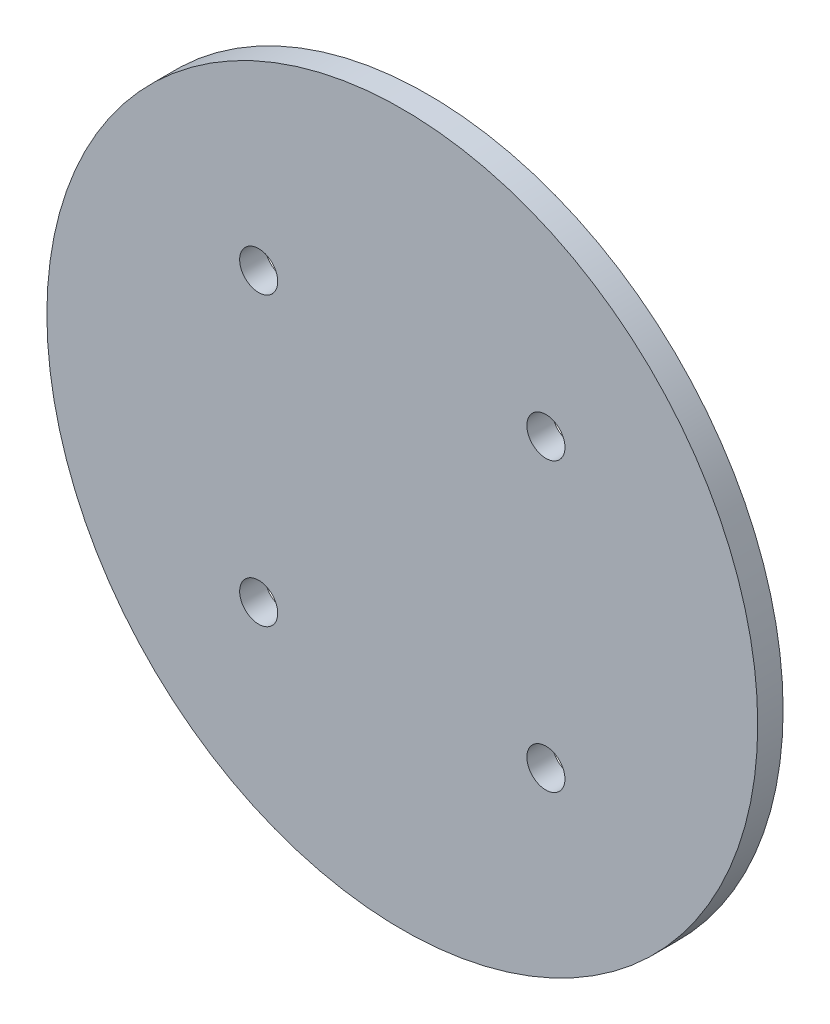
ISO-10303-21;
HEADER;
FILE_DESCRIPTION(('STEP AP214'),'2;1');
FILE_NAME('part.step','',(''),(''),'','','');
FILE_SCHEMA(('AUTOMOTIVE_DESIGN { 1 0 10303 214 1 1 1 1 }'));
ENDSEC;
DATA;
#1=APPLICATION_CONTEXT('core data for automotive mechanical design processes');
#2=APPLICATION_PROTOCOL_DEFINITION('international standard','automotive_design',2000,#1);
#3=PRODUCT_CONTEXT('',#1,'mechanical');
#4=PRODUCT('Part','Part','',(#3));
#5=PRODUCT_RELATED_PRODUCT_CATEGORY('part','',(#4));
#6=PRODUCT_DEFINITION_FORMATION('','',#4);
#7=PRODUCT_DEFINITION_CONTEXT('part definition',#1,'design');
#8=PRODUCT_DEFINITION('design','',#6,#7);
#9=PRODUCT_DEFINITION_SHAPE('','',#8);
#10=(LENGTH_UNIT() NAMED_UNIT(*) SI_UNIT(.MILLI.,.METRE.));
#11=(NAMED_UNIT(*) PLANE_ANGLE_UNIT() SI_UNIT($,.RADIAN.));
#12=(NAMED_UNIT(*) SI_UNIT($,.STERADIAN.) SOLID_ANGLE_UNIT());
#13=UNCERTAINTY_MEASURE_WITH_UNIT(LENGTH_MEASURE(1.E-05),#10,'distance_accuracy_value','');
#14=(GEOMETRIC_REPRESENTATION_CONTEXT(3) GLOBAL_UNCERTAINTY_ASSIGNED_CONTEXT((#13)) GLOBAL_UNIT_ASSIGNED_CONTEXT((#10,
#11,#12)) REPRESENTATION_CONTEXT('',''));
#15=CARTESIAN_POINT('',(0.,0.,0.));
#16=DIRECTION('',(0.,0.,1.));
#17=DIRECTION('',(1.,0.,0.));
#18=AXIS2_PLACEMENT_3D('',#15,#16,#17);
#19=CARTESIAN_POINT('',(0.,0.,6.35));
#20=DIRECTION('',(0.,0.,-1.));
#21=DIRECTION('',(-1.,0.,0.));
#22=AXIS2_PLACEMENT_3D('',#19,#20,#21);
#23=CYLINDRICAL_SURFACE('',#22,88.9);
#24=CARTESIAN_POINT('',(0.,0.,6.35));
#25=DIRECTION('',(0.,0.,1.));
#26=DIRECTION('',(1.,0.,0.));
#27=AXIS2_PLACEMENT_3D('',#24,#25,#26);
#28=CIRCLE('',#27,88.9);
#29=CARTESIAN_POINT('',(88.9,0.,6.35));
#30=VERTEX_POINT('',#29);
#31=EDGE_CURVE('E10',#30,#30,#28,.T.);
#32=ORIENTED_EDGE('',*,*,#31,.F.);
#33=EDGE_LOOP('',(#32));
#34=FACE_BOUND('',#33,.T.);
#35=CARTESIAN_POINT('',(0.,0.,0.));
#36=DIRECTION('',(0.,0.,1.));
#37=DIRECTION('',(1.,0.,0.));
#38=AXIS2_PLACEMENT_3D('',#35,#36,#37);
#39=CIRCLE('',#38,88.9);
#40=CARTESIAN_POINT('',(88.9,0.,0.));
#41=VERTEX_POINT('',#40);
#42=EDGE_CURVE('E34',#41,#41,#39,.T.);
#43=ORIENTED_EDGE('',*,*,#42,.T.);
#44=EDGE_LOOP('',(#43));
#45=FACE_BOUND('',#44,.T.);
#46=ADVANCED_FACE('F31',(#34,#45),#23,.T.);
#47=CARTESIAN_POINT('',(0.,0.,6.35));
#48=DIRECTION('',(0.,0.,1.));
#49=DIRECTION('',(1.,0.,0.));
#50=AXIS2_PLACEMENT_3D('',#47,#48,#49);
#51=PLANE('',#50);
#52=CARTESIAN_POINT('',(-35.9210244842765,-35.9210244842767,6.35));
#53=DIRECTION('',(0.,0.,1.));
#54=DIRECTION('',(1.,0.,0.));
#55=AXIS2_PLACEMENT_3D('',#52,#53,#54);
#56=CIRCLE('',#55,4.7625);
#57=CARTESIAN_POINT('',(-31.1585244842765,-35.9210244842767,6.35));
#58=VERTEX_POINT('',#57);
#59=EDGE_CURVE('E41',#58,#58,#56,.T.);
#60=ORIENTED_EDGE('',*,*,#59,.F.);
#61=EDGE_LOOP('',(#60));
#62=FACE_BOUND('',#61,.T.);
#63=CARTESIAN_POINT('',(35.9210244842766,-35.9210244842767,6.35));
#64=DIRECTION('',(0.,0.,1.));
#65=DIRECTION('',(1.,0.,0.));
#66=AXIS2_PLACEMENT_3D('',#63,#64,#65);
#67=CIRCLE('',#66,4.7625);
#68=CARTESIAN_POINT('',(40.6835244842766,-35.9210244842767,6.35));
#69=VERTEX_POINT('',#68);
#70=EDGE_CURVE('E45',#69,#69,#67,.T.);
#71=ORIENTED_EDGE('',*,*,#70,.F.);
#72=EDGE_LOOP('',(#71));
#73=FACE_BOUND('',#72,.T.);
#74=CARTESIAN_POINT('',(35.9210244842766,35.9210244842767,6.35));
#75=DIRECTION('',(0.,0.,1.));
#76=DIRECTION('',(1.,0.,0.));
#77=AXIS2_PLACEMENT_3D('',#74,#75,#76);
#78=CIRCLE('',#77,4.7625);
#79=CARTESIAN_POINT('',(40.6835244842766,35.9210244842767,6.35));
#80=VERTEX_POINT('',#79);
#81=EDGE_CURVE('E48',#80,#80,#78,.T.);
#82=ORIENTED_EDGE('',*,*,#81,.F.);
#83=EDGE_LOOP('',(#82));
#84=FACE_BOUND('',#83,.T.);
#85=CARTESIAN_POINT('',(-35.9210244842765,35.9210244842767,6.35));
#86=DIRECTION('',(0.,0.,1.));
#87=DIRECTION('',(1.,0.,0.));
#88=AXIS2_PLACEMENT_3D('',#85,#86,#87);
#89=CIRCLE('',#88,4.7625);
#90=CARTESIAN_POINT('',(-31.1585244842765,35.9210244842767,6.35));
#91=VERTEX_POINT('',#90);
#92=EDGE_CURVE('E51',#91,#91,#89,.T.);
#93=ORIENTED_EDGE('',*,*,#92,.F.);
#94=EDGE_LOOP('',(#93));
#95=FACE_BOUND('',#94,.T.);
#96=ORIENTED_EDGE('',*,*,#31,.T.);
#97=EDGE_LOOP('',(#96));
#98=FACE_BOUND('',#97,.T.);
#99=ADVANCED_FACE('F86',(#62,#73,#84,#95,#98),#51,.T.);
#100=CARTESIAN_POINT('',(0.,0.,0.));
#101=DIRECTION('',(0.,0.,1.));
#102=DIRECTION('',(1.,0.,0.));
#103=AXIS2_PLACEMENT_3D('',#100,#101,#102);
#104=PLANE('',#103);
#105=CARTESIAN_POINT('',(-35.9210244842765,-35.9210244842767,0.));
#106=DIRECTION('',(0.,0.,1.));
#107=DIRECTION('',(-1.,0.,0.));
#108=AXIS2_PLACEMENT_3D('',#105,#106,#107);
#109=CIRCLE('',#108,4.7625);
#110=CARTESIAN_POINT('',(-40.6835244842765,-35.9210244842767,0.));
#111=VERTEX_POINT('',#110);
#112=EDGE_CURVE('E58',#111,#111,#109,.T.);
#113=ORIENTED_EDGE('',*,*,#112,.T.);
#114=EDGE_LOOP('',(#113));
#115=FACE_BOUND('',#114,.T.);
#116=CARTESIAN_POINT('',(35.9210244842766,-35.9210244842767,0.));
#117=DIRECTION('',(0.,0.,1.));
#118=DIRECTION('',(1.,0.,0.));
#119=AXIS2_PLACEMENT_3D('',#116,#117,#118);
#120=CIRCLE('',#119,4.7625);
#121=CARTESIAN_POINT('',(40.6835244842766,-35.9210244842767,0.));
#122=VERTEX_POINT('',#121);
#123=EDGE_CURVE('E61',#122,#122,#120,.T.);
#124=ORIENTED_EDGE('',*,*,#123,.T.);
#125=EDGE_LOOP('',(#124));
#126=FACE_BOUND('',#125,.T.);
#127=CARTESIAN_POINT('',(35.9210244842766,35.9210244842767,0.));
#128=DIRECTION('',(0.,0.,1.));
#129=DIRECTION('',(-1.,0.,0.));
#130=AXIS2_PLACEMENT_3D('',#127,#128,#129);
#131=CIRCLE('',#130,4.7625);
#132=CARTESIAN_POINT('',(31.1585244842766,35.9210244842767,0.));
#133=VERTEX_POINT('',#132);
#134=EDGE_CURVE('E57',#133,#133,#131,.T.);
#135=ORIENTED_EDGE('',*,*,#134,.T.);
#136=EDGE_LOOP('',(#135));
#137=FACE_BOUND('',#136,.T.);
#138=CARTESIAN_POINT('',(-35.9210244842765,35.9210244842767,0.));
#139=DIRECTION('',(0.,0.,1.));
#140=DIRECTION('',(1.,0.,0.));
#141=AXIS2_PLACEMENT_3D('',#138,#139,#140);
#142=CIRCLE('',#141,4.7625);
#143=CARTESIAN_POINT('',(-31.1585244842765,35.9210244842767,0.));
#144=VERTEX_POINT('',#143);
#145=EDGE_CURVE('E54',#144,#144,#142,.T.);
#146=ORIENTED_EDGE('',*,*,#145,.T.);
#147=EDGE_LOOP('',(#146));
#148=FACE_BOUND('',#147,.T.);
#149=ORIENTED_EDGE('',*,*,#42,.F.);
#150=EDGE_LOOP('',(#149));
#151=FACE_BOUND('',#150,.T.);
#152=ADVANCED_FACE('F67',(#115,#126,#137,#148,#151),#104,.F.);
#153=CARTESIAN_POINT('',(-35.9210244842765,35.9210244842767,0.));
#154=DIRECTION('',(0.,0.,1.));
#155=DIRECTION('',(1.,0.,0.));
#156=AXIS2_PLACEMENT_3D('',#153,#154,#155);
#157=CYLINDRICAL_SURFACE('',#156,4.7625);
#158=ORIENTED_EDGE('',*,*,#92,.T.);
#159=EDGE_LOOP('',(#158));
#160=FACE_BOUND('',#159,.T.);
#161=ORIENTED_EDGE('',*,*,#145,.F.);
#162=EDGE_LOOP('',(#161));
#163=FACE_BOUND('',#162,.T.);
#164=ADVANCED_FACE('F73',(#160,#163),#157,.F.);
#165=CARTESIAN_POINT('',(35.9210244842766,35.9210244842767,0.));
#166=DIRECTION('',(0.,0.,1.));
#167=DIRECTION('',(1.,0.,0.));
#168=AXIS2_PLACEMENT_3D('',#165,#166,#167);
#169=CYLINDRICAL_SURFACE('',#168,4.7625);
#170=ORIENTED_EDGE('',*,*,#81,.T.);
#171=EDGE_LOOP('',(#170));
#172=FACE_BOUND('',#171,.T.);
#173=ORIENTED_EDGE('',*,*,#134,.F.);
#174=EDGE_LOOP('',(#173));
#175=FACE_BOUND('',#174,.T.);
#176=ADVANCED_FACE('F70',(#172,#175),#169,.F.);
#177=CARTESIAN_POINT('',(35.9210244842766,-35.9210244842767,0.));
#178=DIRECTION('',(0.,0.,1.));
#179=DIRECTION('',(1.,0.,0.));
#180=AXIS2_PLACEMENT_3D('',#177,#178,#179);
#181=CYLINDRICAL_SURFACE('',#180,4.7625);
#182=ORIENTED_EDGE('',*,*,#70,.T.);
#183=EDGE_LOOP('',(#182));
#184=FACE_BOUND('',#183,.T.);
#185=ORIENTED_EDGE('',*,*,#123,.F.);
#186=EDGE_LOOP('',(#185));
#187=FACE_BOUND('',#186,.T.);
#188=ADVANCED_FACE('F72',(#184,#187),#181,.F.);
#189=CARTESIAN_POINT('',(-35.9210244842765,-35.9210244842767,0.));
#190=DIRECTION('',(0.,0.,1.));
#191=DIRECTION('',(1.,0.,0.));
#192=AXIS2_PLACEMENT_3D('',#189,#190,#191);
#193=CYLINDRICAL_SURFACE('',#192,4.7625);
#194=ORIENTED_EDGE('',*,*,#59,.T.);
#195=EDGE_LOOP('',(#194));
#196=FACE_BOUND('',#195,.T.);
#197=ORIENTED_EDGE('',*,*,#112,.F.);
#198=EDGE_LOOP('',(#197));
#199=FACE_BOUND('',#198,.T.);
#200=ADVANCED_FACE('F80',(#196,#199),#193,.F.);
#201=CLOSED_SHELL('',(#46,#99,#152,#164,#176,#188,#200));
#202=MANIFOLD_SOLID_BREP('B2',#201);
#203=ADVANCED_BREP_SHAPE_REPRESENTATION('',(#18,#202),#14);
#204=SHAPE_DEFINITION_REPRESENTATION(#9,#203);
ENDSEC;
END-ISO-10303-21;
